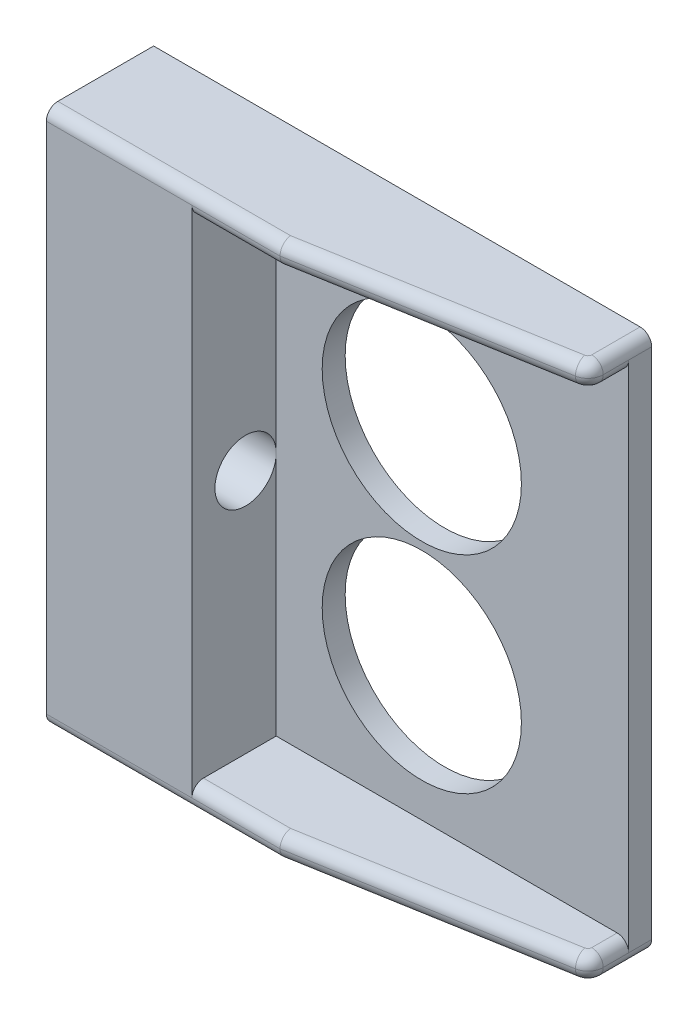
ISO-10303-21;
HEADER;
FILE_DESCRIPTION(('STEP AP214'),'2;1');
FILE_NAME('part.step','',(''),(''),'','','');
FILE_SCHEMA(('AUTOMOTIVE_DESIGN { 1 0 10303 214 1 1 1 1 }'));
ENDSEC;
DATA;
#1=APPLICATION_CONTEXT('core data for automotive mechanical design processes');
#2=APPLICATION_PROTOCOL_DEFINITION('international standard','automotive_design',2000,#1);
#3=PRODUCT_CONTEXT('',#1,'mechanical');
#4=PRODUCT('Part','Part','',(#3));
#5=PRODUCT_RELATED_PRODUCT_CATEGORY('part','',(#4));
#6=PRODUCT_DEFINITION_FORMATION('','',#4);
#7=PRODUCT_DEFINITION_CONTEXT('part definition',#1,'design');
#8=PRODUCT_DEFINITION('design','',#6,#7);
#9=PRODUCT_DEFINITION_SHAPE('','',#8);
#10=(LENGTH_UNIT() NAMED_UNIT(*) SI_UNIT(.MILLI.,.METRE.));
#11=(NAMED_UNIT(*) PLANE_ANGLE_UNIT() SI_UNIT($,.RADIAN.));
#12=(NAMED_UNIT(*) SI_UNIT($,.STERADIAN.) SOLID_ANGLE_UNIT());
#13=UNCERTAINTY_MEASURE_WITH_UNIT(LENGTH_MEASURE(1.E-05),#10,'distance_accuracy_value','');
#14=(GEOMETRIC_REPRESENTATION_CONTEXT(3) GLOBAL_UNCERTAINTY_ASSIGNED_CONTEXT((#13)) GLOBAL_UNIT_ASSIGNED_CONTEXT((#10,
#11,#12)) REPRESENTATION_CONTEXT('',''));
#15=CARTESIAN_POINT('',(0.,0.,0.));
#16=DIRECTION('',(0.,0.,1.));
#17=DIRECTION('',(1.,0.,0.));
#18=AXIS2_PLACEMENT_3D('',#15,#16,#17);
#19=CARTESIAN_POINT('',(0.,0.,3.));
#20=DIRECTION('',(0.,0.,-1.));
#21=DIRECTION('',(-1.,0.,0.));
#22=AXIS2_PLACEMENT_3D('',#19,#20,#21);
#23=PLANE('',#22);
#24=CARTESIAN_POINT('',(5.5,12.5,3.));
#25=DIRECTION('',(0.,0.,1.));
#26=DIRECTION('',(1.,0.,0.));
#27=AXIS2_PLACEMENT_3D('',#24,#25,#26);
#28=CIRCLE('',#27,13.);
#29=CARTESIAN_POINT('',(18.5,12.5,3.));
#30=VERTEX_POINT('',#29);
#31=EDGE_CURVE('E441',#30,#30,#28,.T.);
#32=ORIENTED_EDGE('',*,*,#31,.F.);
#33=EDGE_LOOP('',(#32));
#34=FACE_BOUND('',#33,.T.);
#35=CARTESIAN_POINT('',(5.5,-14.5,3.));
#36=DIRECTION('',(0.,0.,1.));
#37=DIRECTION('',(1.,0.,0.));
#38=AXIS2_PLACEMENT_3D('',#35,#36,#37);
#39=CIRCLE('',#38,13.);
#40=CARTESIAN_POINT('',(18.5,-14.5,3.));
#41=VERTEX_POINT('',#40);
#42=EDGE_CURVE('E437',#41,#41,#39,.T.);
#43=ORIENTED_EDGE('',*,*,#42,.F.);
#44=EDGE_LOOP('',(#43));
#45=FACE_BOUND('',#44,.T.);
#46=DIRECTION('',(0.,1.,0.));
#47=VECTOR('',#46,1.);
#48=CARTESIAN_POINT('',(32.5,-35.,3.));
#49=LINE('',#48,#47);
#50=CARTESIAN_POINT('',(32.5,-33.5,3.));
#51=VERTEX_POINT('',#50);
#52=CARTESIAN_POINT('',(32.5,33.5,3.));
#53=VERTEX_POINT('',#52);
#54=EDGE_CURVE('E389',#51,#53,#49,.T.);
#55=ORIENTED_EDGE('',*,*,#54,.T.);
#56=CARTESIAN_POINT('',(31.,33.5,3.));
#57=DIRECTION('',(0.,0.,-1.));
#58=DIRECTION('',(-1.,0.,0.));
#59=AXIS2_PLACEMENT_3D('',#56,#57,#58);
#60=CIRCLE('',#59,1.5);
#61=CARTESIAN_POINT('',(31.,32.,3.));
#62=VERTEX_POINT('',#61);
#63=EDGE_CURVE('E205',#53,#62,#60,.T.);
#64=ORIENTED_EDGE('',*,*,#63,.T.);
#65=DIRECTION('',(-1.,0.,0.));
#66=VECTOR('',#65,1.);
#67=CARTESIAN_POINT('',(32.5,32.,3.));
#68=LINE('',#67,#66);
#69=CARTESIAN_POINT('',(-13.5,32.,3.));
#70=VERTEX_POINT('',#69);
#71=EDGE_CURVE('E197',#62,#70,#68,.T.);
#72=ORIENTED_EDGE('',*,*,#71,.T.);
#73=DIRECTION('',(0.,1.,0.));
#74=VECTOR('',#73,1.);
#75=CARTESIAN_POINT('',(-13.5,-35.002,3.));
#76=LINE('',#75,#74);
#77=CARTESIAN_POINT('',(-13.5,0.,3.));
#78=VERTEX_POINT('',#77);
#79=EDGE_CURVE('E419',#78,#70,#76,.T.);
#80=ORIENTED_EDGE('',*,*,#79,.F.);
#81=CARTESIAN_POINT('',(-13.5,-32.,3.));
#82=VERTEX_POINT('',#81);
#83=EDGE_CURVE('E415',#82,#78,#76,.T.);
#84=ORIENTED_EDGE('',*,*,#83,.F.);
#85=DIRECTION('',(-1.,0.,0.));
#86=VECTOR('',#85,1.);
#87=CARTESIAN_POINT('',(32.5,-32.,3.));
#88=LINE('',#87,#86);
#89=CARTESIAN_POINT('',(31.,-32.,3.));
#90=VERTEX_POINT('',#89);
#91=EDGE_CURVE('E409',#90,#82,#88,.T.);
#92=ORIENTED_EDGE('',*,*,#91,.F.);
#93=CARTESIAN_POINT('',(31.,-33.5,3.));
#94=DIRECTION('',(0.,0.,-1.));
#95=DIRECTION('',(-1.,0.,0.));
#96=AXIS2_PLACEMENT_3D('',#93,#94,#95);
#97=CIRCLE('',#96,1.5);
#98=EDGE_CURVE('E210',#90,#51,#97,.T.);
#99=ORIENTED_EDGE('',*,*,#98,.T.);
#100=EDGE_LOOP('',(#55,#64,#72,#80,#84,#92,#99));
#101=FACE_BOUND('',#100,.T.);
#102=ADVANCED_FACE('F55',(#34,#45,#101),#23,.F.);
#103=CARTESIAN_POINT('',(0.,32.,0.));
#104=DIRECTION('',(0.,-1.,0.));
#105=DIRECTION('',(0.,0.,-1.));
#106=AXIS2_PLACEMENT_3D('',#103,#104,#105);
#107=PLANE('',#106);
#108=ORIENTED_EDGE('',*,*,#71,.F.);
#109=DIRECTION('',(0.,0.,-1.));
#110=VECTOR('',#109,1.);
#111=CARTESIAN_POINT('',(31.,32.,6.31780564696891));
#112=LINE('',#111,#110);
#113=CARTESIAN_POINT('',(31.,32.,6.31780564696891));
#114=VERTEX_POINT('',#113);
#115=EDGE_CURVE('E361',#62,#114,#112,.F.);
#116=ORIENTED_EDGE('',*,*,#115,.T.);
#117=CARTESIAN_POINT('',(30.5,32.,6.31780564696891));
#118=DIRECTION('',(0.,-1.,0.));
#119=DIRECTION('',(0.,0.,-1.));
#120=AXIS2_PLACEMENT_3D('',#117,#118,#119);
#121=CIRCLE('',#120,0.5);
#122=CARTESIAN_POINT('',(30.5856705873756,32.,6.81041152437875));
#123=VERTEX_POINT('',#122);
#124=EDGE_CURVE('E365',#114,#123,#121,.T.);
#125=ORIENTED_EDGE('',*,*,#124,.T.);
#126=DIRECTION('',(0.985211754819674,0.,-0.171341174751248));
#127=VECTOR('',#126,1.);
#128=CARTESIAN_POINT('',(2.04757539383643,32.,11.7735585145595));
#129=LINE('',#128,#127);
#130=CARTESIAN_POINT('',(-2.12946314744656,32.,12.5));
#131=VERTEX_POINT('',#130);
#132=EDGE_CURVE('E369',#123,#131,#129,.F.);
#133=ORIENTED_EDGE('',*,*,#132,.T.);
#134=DIRECTION('',(1.,0.,0.));
#135=VECTOR('',#134,1.);
#136=CARTESIAN_POINT('',(0.,32.,12.5));
#137=LINE('',#136,#135);
#138=CARTESIAN_POINT('',(-13.5,32.,12.5));
#139=VERTEX_POINT('',#138);
#140=EDGE_CURVE('E373',#131,#139,#137,.F.);
#141=ORIENTED_EDGE('',*,*,#140,.T.);
#142=DIRECTION('',(0.,0.,1.));
#143=VECTOR('',#142,1.);
#144=CARTESIAN_POINT('',(-13.5,32.,3.));
#145=LINE('',#144,#143);
#146=EDGE_CURVE('E257',#70,#139,#145,.T.);
#147=ORIENTED_EDGE('',*,*,#146,.F.);
#148=EDGE_LOOP('',(#108,#116,#125,#133,#141,#147));
#149=FACE_BOUND('',#148,.T.);
#150=ADVANCED_FACE('F462',(#149),#107,.T.);
#151=CARTESIAN_POINT('',(0.,-32.,0.));
#152=DIRECTION('',(0.,-1.,0.));
#153=DIRECTION('',(0.,0.,-1.));
#154=AXIS2_PLACEMENT_3D('',#151,#152,#153);
#155=PLANE('',#154);
#156=CARTESIAN_POINT('',(30.5,-32.,6.31780564696891));
#157=DIRECTION('',(0.,-1.,0.));
#158=DIRECTION('',(0.,0.,-1.));
#159=AXIS2_PLACEMENT_3D('',#156,#157,#158);
#160=CIRCLE('',#159,0.5);
#161=CARTESIAN_POINT('',(30.5856705873756,-32.,6.81041152437875));
#162=VERTEX_POINT('',#161);
#163=CARTESIAN_POINT('',(31.,-32.,6.31780564696891));
#164=VERTEX_POINT('',#163);
#165=EDGE_CURVE('E296',#162,#164,#160,.F.);
#166=ORIENTED_EDGE('',*,*,#165,.T.);
#167=DIRECTION('',(0.,0.,-1.));
#168=VECTOR('',#167,1.);
#169=CARTESIAN_POINT('',(31.,-32.,0.));
#170=LINE('',#169,#168);
#171=EDGE_CURVE('E287',#164,#90,#170,.T.);
#172=ORIENTED_EDGE('',*,*,#171,.T.);
#173=ORIENTED_EDGE('',*,*,#91,.T.);
#174=DIRECTION('',(0.,0.,1.));
#175=VECTOR('',#174,1.);
#176=CARTESIAN_POINT('',(-13.5,-32.,3.));
#177=LINE('',#176,#175);
#178=CARTESIAN_POINT('',(-13.5,-32.,12.5));
#179=VERTEX_POINT('',#178);
#180=EDGE_CURVE('E412',#82,#179,#177,.T.);
#181=ORIENTED_EDGE('',*,*,#180,.T.);
#182=DIRECTION('',(1.,0.,0.));
#183=VECTOR('',#182,1.);
#184=CARTESIAN_POINT('',(-2.,-32.,12.5));
#185=LINE('',#184,#183);
#186=CARTESIAN_POINT('',(-2.12946314744658,-32.,12.5));
#187=VERTEX_POINT('',#186);
#188=EDGE_CURVE('E337',#179,#187,#185,.T.);
#189=ORIENTED_EDGE('',*,*,#188,.T.);
#190=DIRECTION('',(0.985211754819674,0.,-0.171341174751248));
#191=VECTOR('',#190,1.);
#192=CARTESIAN_POINT('',(30.5856705873756,-32.,6.81041152437875));
#193=LINE('',#192,#191);
#194=EDGE_CURVE('E141',#187,#162,#193,.T.);
#195=ORIENTED_EDGE('',*,*,#194,.T.);
#196=EDGE_LOOP('',(#166,#172,#173,#181,#189,#195));
#197=FACE_BOUND('',#196,.T.);
#198=ADVANCED_FACE('F335',(#197),#155,.F.);
#199=CARTESIAN_POINT('',(-32.5,-35.,3.));
#200=DIRECTION('',(1.,0.,0.));
#201=DIRECTION('',(0.,0.,-1.));
#202=AXIS2_PLACEMENT_3D('',#199,#200,#201);
#203=PLANE('',#202);
#204=CARTESIAN_POINT('',(-32.5,0.,7.));
#205=DIRECTION('',(-1.,0.,0.));
#206=DIRECTION('',(0.,0.,1.));
#207=AXIS2_PLACEMENT_3D('',#204,#205,#206);
#208=CIRCLE('',#207,4.025);
#209=CARTESIAN_POINT('',(-32.5,0.,11.025));
#210=VERTEX_POINT('',#209);
#211=EDGE_CURVE('E429',#210,#210,#208,.T.);
#212=ORIENTED_EDGE('',*,*,#211,.F.);
#213=EDGE_LOOP('',(#212));
#214=FACE_BOUND('',#213,.T.);
#215=DIRECTION('',(0.,1.,0.));
#216=VECTOR('',#215,1.);
#217=CARTESIAN_POINT('',(-32.5,32.,14.));
#218=LINE('',#217,#216);
#219=CARTESIAN_POINT('',(-32.5,-33.5,14.));
#220=VERTEX_POINT('',#219);
#221=CARTESIAN_POINT('',(-32.5,33.5,14.));
#222=VERTEX_POINT('',#221);
#223=EDGE_CURVE('E179',#220,#222,#218,.T.);
#224=ORIENTED_EDGE('',*,*,#223,.T.);
#225=CARTESIAN_POINT('',(-32.5,33.5,12.5));
#226=DIRECTION('',(1.,0.,0.));
#227=DIRECTION('',(0.,0.,-1.));
#228=AXIS2_PLACEMENT_3D('',#225,#226,#227);
#229=CIRCLE('',#228,1.5);
#230=CARTESIAN_POINT('',(-32.5,35.,12.5));
#231=VERTEX_POINT('',#230);
#232=EDGE_CURVE('E192',#222,#231,#229,.F.);
#233=ORIENTED_EDGE('',*,*,#232,.T.);
#234=DIRECTION('',(0.,0.,-1.));
#235=VECTOR('',#234,1.);
#236=CARTESIAN_POINT('',(-32.5,35.,3.));
#237=LINE('',#236,#235);
#238=CARTESIAN_POINT('',(-32.5,35.,0.));
#239=VERTEX_POINT('',#238);
#240=EDGE_CURVE('E386',#231,#239,#237,.T.);
#241=ORIENTED_EDGE('',*,*,#240,.T.);
#242=DIRECTION('',(0.,-1.,0.));
#243=VECTOR('',#242,1.);
#244=CARTESIAN_POINT('',(-32.5,-35.,0.));
#245=LINE('',#244,#243);
#246=CARTESIAN_POINT('',(-32.5,-35.,0.));
#247=VERTEX_POINT('',#246);
#248=EDGE_CURVE('E196',#239,#247,#245,.T.);
#249=ORIENTED_EDGE('',*,*,#248,.T.);
#250=DIRECTION('',(0.,0.,-1.));
#251=VECTOR('',#250,1.);
#252=CARTESIAN_POINT('',(-32.5,-35.,3.));
#253=LINE('',#252,#251);
#254=CARTESIAN_POINT('',(-32.5,-35.,12.5));
#255=VERTEX_POINT('',#254);
#256=EDGE_CURVE('E383',#255,#247,#253,.T.);
#257=ORIENTED_EDGE('',*,*,#256,.F.);
#258=CARTESIAN_POINT('',(-32.5,-33.5,12.5));
#259=DIRECTION('',(1.,0.,0.));
#260=DIRECTION('',(0.,0.,-1.));
#261=AXIS2_PLACEMENT_3D('',#258,#259,#260);
#262=CIRCLE('',#261,1.5);
#263=EDGE_CURVE('E184',#255,#220,#262,.F.);
#264=ORIENTED_EDGE('',*,*,#263,.T.);
#265=EDGE_LOOP('',(#224,#233,#241,#249,#257,#264));
#266=FACE_BOUND('',#265,.T.);
#267=ADVANCED_FACE('F189',(#214,#266),#203,.F.);
#268=CARTESIAN_POINT('',(-32.5,-35.,3.));
#269=DIRECTION('',(0.,1.,0.));
#270=DIRECTION('',(0.,0.,1.));
#271=AXIS2_PLACEMENT_3D('',#268,#269,#270);
#272=PLANE('',#271);
#273=DIRECTION('',(1.,0.,0.));
#274=VECTOR('',#273,1.);
#275=CARTESIAN_POINT('',(-32.5,-35.,0.));
#276=LINE('',#275,#274);
#277=CARTESIAN_POINT('',(31.,-35.,0.));
#278=VERTEX_POINT('',#277);
#279=EDGE_CURVE('E317',#247,#278,#276,.T.);
#280=ORIENTED_EDGE('',*,*,#279,.T.);
#281=DIRECTION('',(0.,0.,-1.));
#282=VECTOR('',#281,1.);
#283=CARTESIAN_POINT('',(31.,-35.,3.));
#284=LINE('',#283,#282);
#285=CARTESIAN_POINT('',(31.,-35.,6.31780564696891));
#286=VERTEX_POINT('',#285);
#287=EDGE_CURVE('E308',#278,#286,#284,.F.);
#288=ORIENTED_EDGE('',*,*,#287,.T.);
#289=CARTESIAN_POINT('',(30.5,-35.,6.31780564696891));
#290=DIRECTION('',(0.,1.,0.));
#291=DIRECTION('',(0.,0.,1.));
#292=AXIS2_PLACEMENT_3D('',#289,#290,#291);
#293=CIRCLE('',#292,0.5);
#294=CARTESIAN_POINT('',(30.5856705873756,-35.,6.81041152437875));
#295=VERTEX_POINT('',#294);
#296=EDGE_CURVE('E158',#286,#295,#293,.F.);
#297=ORIENTED_EDGE('',*,*,#296,.T.);
#298=DIRECTION('',(0.985211754819674,0.,-0.171341174751248));
#299=VECTOR('',#298,1.);
#300=CARTESIAN_POINT('',(-2.25701176212687,-35.,12.5221823677705));
#301=LINE('',#300,#299);
#302=CARTESIAN_POINT('',(-2.12946314744656,-35.,12.5));
#303=VERTEX_POINT('',#302);
#304=EDGE_CURVE('E295',#295,#303,#301,.F.);
#305=ORIENTED_EDGE('',*,*,#304,.T.);
#306=DIRECTION('',(1.,0.,0.));
#307=VECTOR('',#306,1.);
#308=CARTESIAN_POINT('',(-32.5,-35.,12.5));
#309=LINE('',#308,#307);
#310=EDGE_CURVE('E113',#303,#255,#309,.F.);
#311=ORIENTED_EDGE('',*,*,#310,.T.);
#312=ORIENTED_EDGE('',*,*,#256,.T.);
#313=EDGE_LOOP('',(#280,#288,#297,#305,#311,#312));
#314=FACE_BOUND('',#313,.T.);
#315=ADVANCED_FACE('F313',(#314),#272,.F.);
#316=CARTESIAN_POINT('',(32.5,-35.,3.));
#317=DIRECTION('',(-1.,0.,0.));
#318=DIRECTION('',(0.,0.,1.));
#319=AXIS2_PLACEMENT_3D('',#316,#317,#318);
#320=PLANE('',#319);
#321=DIRECTION('',(0.,0.,-1.));
#322=VECTOR('',#321,1.);
#323=CARTESIAN_POINT('',(32.5,33.5,3.));
#324=LINE('',#323,#322);
#325=CARTESIAN_POINT('',(32.5,33.5,0.));
#326=VERTEX_POINT('',#325);
#327=EDGE_CURVE('E377',#326,#53,#324,.F.);
#328=ORIENTED_EDGE('',*,*,#327,.T.);
#329=ORIENTED_EDGE('',*,*,#54,.F.);
#330=DIRECTION('',(0.,0.,-1.));
#331=VECTOR('',#330,1.);
#332=CARTESIAN_POINT('',(32.5,-33.5,3.));
#333=LINE('',#332,#331);
#334=CARTESIAN_POINT('',(32.5,-33.5,0.));
#335=VERTEX_POINT('',#334);
#336=EDGE_CURVE('E282',#51,#335,#333,.T.);
#337=ORIENTED_EDGE('',*,*,#336,.T.);
#338=DIRECTION('',(0.,1.,0.));
#339=VECTOR('',#338,1.);
#340=CARTESIAN_POINT('',(32.5,-35.,0.));
#341=LINE('',#340,#339);
#342=EDGE_CURVE('E394',#335,#326,#341,.T.);
#343=ORIENTED_EDGE('',*,*,#342,.T.);
#344=EDGE_LOOP('',(#328,#329,#337,#343));
#345=FACE_BOUND('',#344,.T.);
#346=ADVANCED_FACE('F476',(#345),#320,.F.);
#347=CARTESIAN_POINT('',(-32.5,35.,3.));
#348=DIRECTION('',(0.,-1.,0.));
#349=DIRECTION('',(0.,0.,-1.));
#350=AXIS2_PLACEMENT_3D('',#347,#348,#349);
#351=PLANE('',#350);
#352=CARTESIAN_POINT('',(30.5,35.,6.31780564696891));
#353=DIRECTION('',(0.,-1.,0.));
#354=DIRECTION('',(0.,0.,-1.));
#355=AXIS2_PLACEMENT_3D('',#352,#353,#354);
#356=CIRCLE('',#355,0.5);
#357=CARTESIAN_POINT('',(30.5856705873756,35.,6.81041152437875));
#358=VERTEX_POINT('',#357);
#359=CARTESIAN_POINT('',(31.,35.,6.31780564696891));
#360=VERTEX_POINT('',#359);
#361=EDGE_CURVE('E352',#358,#360,#356,.F.);
#362=ORIENTED_EDGE('',*,*,#361,.T.);
#363=DIRECTION('',(0.,0.,-1.));
#364=VECTOR('',#363,1.);
#365=CARTESIAN_POINT('',(31.,35.,3.));
#366=LINE('',#365,#364);
#367=CARTESIAN_POINT('',(31.,35.,0.));
#368=VERTEX_POINT('',#367);
#369=EDGE_CURVE('E348',#360,#368,#366,.T.);
#370=ORIENTED_EDGE('',*,*,#369,.T.);
#371=DIRECTION('',(-1.,0.,0.));
#372=VECTOR('',#371,1.);
#373=CARTESIAN_POINT('',(-32.5,35.,0.));
#374=LINE('',#373,#372);
#375=EDGE_CURVE('E390',#368,#239,#374,.T.);
#376=ORIENTED_EDGE('',*,*,#375,.T.);
#377=ORIENTED_EDGE('',*,*,#240,.F.);
#378=DIRECTION('',(1.,0.,0.));
#379=VECTOR('',#378,1.);
#380=CARTESIAN_POINT('',(-2.,35.,12.5));
#381=LINE('',#380,#379);
#382=CARTESIAN_POINT('',(-2.12946314744656,35.,12.5));
#383=VERTEX_POINT('',#382);
#384=EDGE_CURVE('E203',#231,#383,#381,.T.);
#385=ORIENTED_EDGE('',*,*,#384,.T.);
#386=DIRECTION('',(0.985211754819674,0.,-0.171341174751248));
#387=VECTOR('',#386,1.);
#388=CARTESIAN_POINT('',(30.5856705873756,35.,6.81041152437875));
#389=LINE('',#388,#387);
#390=EDGE_CURVE('E355',#383,#358,#389,.T.);
#391=ORIENTED_EDGE('',*,*,#390,.T.);
#392=EDGE_LOOP('',(#362,#370,#376,#377,#385,#391));
#393=FACE_BOUND('',#392,.T.);
#394=ADVANCED_FACE('F506',(#393),#351,.F.);
#395=CARTESIAN_POINT('',(0.,0.,0.));
#396=DIRECTION('',(0.,0.,-1.));
#397=DIRECTION('',(-1.,0.,0.));
#398=AXIS2_PLACEMENT_3D('',#395,#396,#397);
#399=PLANE('',#398);
#400=CARTESIAN_POINT('',(5.5,12.5,0.));
#401=DIRECTION('',(0.,0.,1.));
#402=DIRECTION('',(1.,0.,0.));
#403=AXIS2_PLACEMENT_3D('',#400,#401,#402);
#404=CIRCLE('',#403,13.);
#405=CARTESIAN_POINT('',(18.5,12.5,0.));
#406=VERTEX_POINT('',#405);
#407=EDGE_CURVE('E445',#406,#406,#404,.T.);
#408=ORIENTED_EDGE('',*,*,#407,.T.);
#409=EDGE_LOOP('',(#408));
#410=FACE_BOUND('',#409,.T.);
#411=CARTESIAN_POINT('',(5.5,-14.5,0.));
#412=DIRECTION('',(0.,0.,1.));
#413=DIRECTION('',(1.,0.,0.));
#414=AXIS2_PLACEMENT_3D('',#411,#412,#413);
#415=CIRCLE('',#414,13.);
#416=CARTESIAN_POINT('',(18.5,-14.5,0.));
#417=VERTEX_POINT('',#416);
#418=EDGE_CURVE('E433',#417,#417,#415,.T.);
#419=ORIENTED_EDGE('',*,*,#418,.T.);
#420=EDGE_LOOP('',(#419));
#421=FACE_BOUND('',#420,.T.);
#422=ORIENTED_EDGE('',*,*,#375,.F.);
#423=CARTESIAN_POINT('',(31.,33.5,0.));
#424=DIRECTION('',(0.,0.,-1.));
#425=DIRECTION('',(-1.,0.,0.));
#426=AXIS2_PLACEMENT_3D('',#423,#424,#425);
#427=CIRCLE('',#426,1.5);
#428=EDGE_CURVE('E340',#368,#326,#427,.T.);
#429=ORIENTED_EDGE('',*,*,#428,.T.);
#430=ORIENTED_EDGE('',*,*,#342,.F.);
#431=CARTESIAN_POINT('',(31.,-33.5,0.));
#432=DIRECTION('',(0.,0.,-1.));
#433=DIRECTION('',(-1.,0.,0.));
#434=AXIS2_PLACEMENT_3D('',#431,#432,#433);
#435=CIRCLE('',#434,1.5);
#436=EDGE_CURVE('E320',#335,#278,#435,.T.);
#437=ORIENTED_EDGE('',*,*,#436,.T.);
#438=ORIENTED_EDGE('',*,*,#279,.F.);
#439=ORIENTED_EDGE('',*,*,#248,.F.);
#440=EDGE_LOOP('',(#422,#429,#430,#437,#438,#439));
#441=FACE_BOUND('',#440,.T.);
#442=ADVANCED_FACE('F450',(#410,#421,#441),#399,.T.);
#443=CARTESIAN_POINT('',(-2.,32.,14.));
#444=DIRECTION('',(0.,0.,1.));
#445=DIRECTION('',(1.,0.,0.));
#446=AXIS2_PLACEMENT_3D('',#443,#444,#445);
#447=PLANE('',#446);
#448=DIRECTION('',(0.,1.,0.));
#449=VECTOR('',#448,1.);
#450=CARTESIAN_POINT('',(-13.5,-35.002,14.));
#451=LINE('',#450,#449);
#452=CARTESIAN_POINT('',(-13.5,-33.5,14.));
#453=VERTEX_POINT('',#452);
#454=CARTESIAN_POINT('',(-13.5,33.5,14.));
#455=VERTEX_POINT('',#454);
#456=EDGE_CURVE('E78',#453,#455,#451,.T.);
#457=ORIENTED_EDGE('',*,*,#456,.T.);
#458=DIRECTION('',(1.,0.,0.));
#459=VECTOR('',#458,1.);
#460=CARTESIAN_POINT('',(-32.5,33.5,14.));
#461=LINE('',#460,#459);
#462=EDGE_CURVE('E176',#455,#222,#461,.F.);
#463=ORIENTED_EDGE('',*,*,#462,.T.);
#464=ORIENTED_EDGE('',*,*,#223,.F.);
#465=DIRECTION('',(1.,0.,0.));
#466=VECTOR('',#465,1.);
#467=CARTESIAN_POINT('',(-2.,-33.5,14.));
#468=LINE('',#467,#466);
#469=EDGE_CURVE('E185',#220,#453,#468,.T.);
#470=ORIENTED_EDGE('',*,*,#469,.T.);
#471=EDGE_LOOP('',(#457,#463,#464,#470));
#472=FACE_BOUND('',#471,.T.);
#473=ADVANCED_FACE('F178',(#472),#447,.T.);
#474=CARTESIAN_POINT('',(-13.5,-35.002,3.));
#475=DIRECTION('',(-1.,0.,0.));
#476=DIRECTION('',(0.,0.,1.));
#477=AXIS2_PLACEMENT_3D('',#474,#475,#476);
#478=PLANE('',#477);
#479=ORIENTED_EDGE('',*,*,#83,.T.);
#480=CARTESIAN_POINT('',(-13.5,0.,7.));
#481=DIRECTION('',(-1.,0.,0.));
#482=DIRECTION('',(0.,0.,1.));
#483=AXIS2_PLACEMENT_3D('',#480,#481,#482);
#484=CIRCLE('',#483,4.);
#485=EDGE_CURVE('E59',#78,#78,#484,.T.);
#486=ORIENTED_EDGE('',*,*,#485,.T.);
#487=ORIENTED_EDGE('',*,*,#79,.T.);
#488=ORIENTED_EDGE('',*,*,#146,.T.);
#489=CARTESIAN_POINT('',(-13.5,33.5,12.5));
#490=DIRECTION('',(-1.,0.,0.));
#491=DIRECTION('',(0.,0.,1.));
#492=AXIS2_PLACEMENT_3D('',#489,#490,#491);
#493=CIRCLE('',#492,1.5);
#494=EDGE_CURVE('E65',#139,#455,#493,.T.);
#495=ORIENTED_EDGE('',*,*,#494,.T.);
#496=ORIENTED_EDGE('',*,*,#456,.F.);
#497=CARTESIAN_POINT('',(-13.5,-33.5,12.5));
#498=DIRECTION('',(-1.,0.,0.));
#499=DIRECTION('',(0.,0.,1.));
#500=AXIS2_PLACEMENT_3D('',#497,#498,#499);
#501=CIRCLE('',#500,1.5);
#502=EDGE_CURVE('E11',#453,#179,#501,.T.);
#503=ORIENTED_EDGE('',*,*,#502,.T.);
#504=ORIENTED_EDGE('',*,*,#180,.F.);
#505=EDGE_LOOP('',(#479,#486,#487,#488,#495,#496,#503,#504));
#506=FACE_BOUND('',#505,.T.);
#507=ADVANCED_FACE('F554',(#506),#478,.F.);
#508=CARTESIAN_POINT('',(-32.5,33.5,12.5));
#509=DIRECTION('',(-1.,0.,0.));
#510=DIRECTION('',(0.,0.,1.));
#511=AXIS2_PLACEMENT_3D('',#508,#509,#510);
#512=CYLINDRICAL_SURFACE('',#511,1.5);
#513=ORIENTED_EDGE('',*,*,#232,.F.);
#514=ORIENTED_EDGE('',*,*,#462,.F.);
#515=DIRECTION('',(1.,0.,0.));
#516=VECTOR('',#515,1.);
#517=CARTESIAN_POINT('',(-32.5,33.5,14.));
#518=LINE('',#517,#516);
#519=CARTESIAN_POINT('',(-2.,33.5,14.));
#520=VERTEX_POINT('',#519);
#521=EDGE_CURVE('E254',#520,#455,#518,.F.);
#522=ORIENTED_EDGE('',*,*,#521,.F.);
#523=CARTESIAN_POINT('',(-2.12946314744656,33.5,12.5));
#524=DIRECTION('',(-0.996296079190236,0.,0.0859890841337594));
#525=DIRECTION('',(-0.0859890841337594,0.,-0.996296079190236));
#526=AXIS2_PLACEMENT_3D('',#523,#524,#525);
#527=ELLIPSE('',#526,1.50557653626336,1.5);
#528=EDGE_CURVE('E250',#383,#520,#527,.F.);
#529=ORIENTED_EDGE('',*,*,#528,.F.);
#530=ORIENTED_EDGE('',*,*,#384,.F.);
#531=EDGE_LOOP('',(#513,#514,#522,#529,#530));
#532=FACE_BOUND('',#531,.T.);
#533=ADVANCED_FACE('F200',(#532),#512,.T.);
#534=CARTESIAN_POINT('',(-2.,33.5,12.5));
#535=DIRECTION('',(1.,0.,0.));
#536=DIRECTION('',(0.,0.,-1.));
#537=AXIS2_PLACEMENT_3D('',#534,#535,#536);
#538=CYLINDRICAL_SURFACE('',#537,1.5);
#539=ORIENTED_EDGE('',*,*,#494,.F.);
#540=ORIENTED_EDGE('',*,*,#140,.F.);
#541=CARTESIAN_POINT('',(-2.12946314744657,33.5,12.5));
#542=DIRECTION('',(0.996296079190236,0.,-0.0859890841337594));
#543=DIRECTION('',(0.0859890841337594,0.,0.996296079190236));
#544=AXIS2_PLACEMENT_3D('',#541,#542,#543);
#545=ELLIPSE('',#544,1.50557653626336,1.5);
#546=EDGE_CURVE('E246',#520,#131,#545,.T.);
#547=ORIENTED_EDGE('',*,*,#546,.F.);
#548=ORIENTED_EDGE('',*,*,#521,.T.);
#549=EDGE_LOOP('',(#539,#540,#547,#548));
#550=FACE_BOUND('',#549,.T.);
#551=ADVANCED_FACE('F532',(#550),#538,.T.);
#552=CARTESIAN_POINT('',(-30.0047181841452,33.5,17.347870441165));
#553=DIRECTION('',(-0.985211754819674,0.,0.171341174751248));
#554=DIRECTION('',(0.171341174751248,0.,0.985211754819674));
#555=AXIS2_PLACEMENT_3D('',#552,#553,#554);
#556=CYLINDRICAL_SURFACE('',#555,1.5);
#557=ORIENTED_EDGE('',*,*,#390,.F.);
#558=ORIENTED_EDGE('',*,*,#528,.T.);
#559=DIRECTION('',(0.985211754819674,0.,-0.171341174751248));
#560=VECTOR('',#559,1.);
#561=CARTESIAN_POINT('',(-2.,33.5,14.));
#562=LINE('',#561,#560);
#563=CARTESIAN_POINT('',(30.8426823495025,33.5,8.28822915660826));
#564=VERTEX_POINT('',#563);
#565=EDGE_CURVE('E242',#564,#520,#562,.F.);
#566=ORIENTED_EDGE('',*,*,#565,.F.);
#567=CARTESIAN_POINT('',(30.5856705873756,33.5,6.81041152437875));
#568=DIRECTION('',(0.985211754819674,0.,-0.171341174751249));
#569=DIRECTION('',(-0.171341174751249,0.,-0.985211754819674));
#570=AXIS2_PLACEMENT_3D('',#567,#568,#569);
#571=CIRCLE('',#570,1.5);
#572=EDGE_CURVE('E238',#358,#564,#571,.T.);
#573=ORIENTED_EDGE('',*,*,#572,.F.);
#574=EDGE_LOOP('',(#557,#558,#566,#573));
#575=FACE_BOUND('',#574,.T.);
#576=ADVANCED_FACE('F509',(#575),#556,.T.);
#577=CARTESIAN_POINT('',(32.2429882378731,33.5,6.52218236777049));
#578=DIRECTION('',(0.985211754819674,0.,-0.171341174751248));
#579=DIRECTION('',(-0.171341174751248,0.,-0.985211754819674));
#580=AXIS2_PLACEMENT_3D('',#577,#578,#579);
#581=CYLINDRICAL_SURFACE('',#580,1.5);
#582=ORIENTED_EDGE('',*,*,#546,.T.);
#583=ORIENTED_EDGE('',*,*,#132,.F.);
#584=CARTESIAN_POINT('',(30.5856705873756,33.5,6.81041152437875));
#585=DIRECTION('',(0.985211754819675,0.,-0.171341174751247));
#586=DIRECTION('',(-0.171341174751247,0.,-0.985211754819675));
#587=AXIS2_PLACEMENT_3D('',#584,#585,#586);
#588=CIRCLE('',#587,1.5);
#589=EDGE_CURVE('E234',#564,#123,#588,.T.);
#590=ORIENTED_EDGE('',*,*,#589,.F.);
#591=ORIENTED_EDGE('',*,*,#565,.T.);
#592=EDGE_LOOP('',(#582,#583,#590,#591));
#593=FACE_BOUND('',#592,.T.);
#594=ADVANCED_FACE('F533',(#593),#581,.T.);
#595=CARTESIAN_POINT('',(30.5,33.5,6.31780564696891));
#596=DIRECTION('',(0.,-1.,0.));
#597=DIRECTION('',(0.,0.,-1.));
#598=AXIS2_PLACEMENT_3D('',#595,#596,#597);
#599=DEGENERATE_TOROIDAL_SURFACE('',#598,0.5,1.5,.T.);
#600=ORIENTED_EDGE('',*,*,#361,.F.);
#601=ORIENTED_EDGE('',*,*,#572,.T.);
#602=CARTESIAN_POINT('',(30.5,33.5,6.31780564696891));
#603=DIRECTION('',(0.,-1.,0.));
#604=DIRECTION('',(0.,0.,-1.));
#605=AXIS2_PLACEMENT_3D('',#602,#603,#604);
#606=CIRCLE('',#605,2.);
#607=CARTESIAN_POINT('',(32.5,33.5,6.31780564696891));
#608=VERTEX_POINT('',#607);
#609=EDGE_CURVE('E230',#608,#564,#606,.T.);
#610=ORIENTED_EDGE('',*,*,#609,.F.);
#611=CARTESIAN_POINT('',(31.,33.5,6.31780564696891));
#612=DIRECTION('',(0.,0.,-1.));
#613=DIRECTION('',(-1.,0.,0.));
#614=AXIS2_PLACEMENT_3D('',#611,#612,#613);
#615=CIRCLE('',#614,1.5);
#616=EDGE_CURVE('E226',#360,#608,#615,.T.);
#617=ORIENTED_EDGE('',*,*,#616,.F.);
#618=EDGE_LOOP('',(#600,#601,#610,#617));
#619=FACE_BOUND('',#618,.T.);
#620=ADVANCED_FACE('F512',(#619),#599,.T.);
#621=CARTESIAN_POINT('',(30.5,33.5,6.31780564696891));
#622=DIRECTION('',(0.,-1.,0.));
#623=DIRECTION('',(0.,0.,-1.));
#624=AXIS2_PLACEMENT_3D('',#621,#622,#623);
#625=DEGENERATE_TOROIDAL_SURFACE('',#624,0.5,1.5,.T.);
#626=ORIENTED_EDGE('',*,*,#589,.T.);
#627=ORIENTED_EDGE('',*,*,#124,.F.);
#628=CARTESIAN_POINT('',(31.,33.5,6.31780564696891));
#629=DIRECTION('',(0.,0.,-1.));
#630=DIRECTION('',(-1.,0.,0.));
#631=AXIS2_PLACEMENT_3D('',#628,#629,#630);
#632=CIRCLE('',#631,1.5);
#633=EDGE_CURVE('E222',#608,#114,#632,.T.);
#634=ORIENTED_EDGE('',*,*,#633,.F.);
#635=ORIENTED_EDGE('',*,*,#609,.T.);
#636=EDGE_LOOP('',(#626,#627,#634,#635));
#637=FACE_BOUND('',#636,.T.);
#638=ADVANCED_FACE('F535',(#637),#625,.T.);
#639=CARTESIAN_POINT('',(31.,33.5,3.));
#640=DIRECTION('',(0.,0.,-1.));
#641=DIRECTION('',(-1.,0.,0.));
#642=AXIS2_PLACEMENT_3D('',#639,#640,#641);
#643=CYLINDRICAL_SURFACE('',#642,1.5);
#644=ORIENTED_EDGE('',*,*,#369,.F.);
#645=ORIENTED_EDGE('',*,*,#616,.T.);
#646=DIRECTION('',(0.,0.,-1.));
#647=VECTOR('',#646,1.);
#648=CARTESIAN_POINT('',(32.5,33.5,3.));
#649=LINE('',#648,#647);
#650=EDGE_CURVE('E118',#53,#608,#649,.F.);
#651=ORIENTED_EDGE('',*,*,#650,.F.);
#652=ORIENTED_EDGE('',*,*,#327,.F.);
#653=ORIENTED_EDGE('',*,*,#428,.F.);
#654=EDGE_LOOP('',(#644,#645,#651,#652,#653));
#655=FACE_BOUND('',#654,.T.);
#656=ADVANCED_FACE('F481',(#655),#643,.T.);
#657=CARTESIAN_POINT('',(31.,33.5,3.));
#658=DIRECTION('',(0.,0.,1.));
#659=DIRECTION('',(1.,0.,0.));
#660=AXIS2_PLACEMENT_3D('',#657,#658,#659);
#661=CYLINDRICAL_SURFACE('',#660,1.5);
#662=ORIENTED_EDGE('',*,*,#633,.T.);
#663=ORIENTED_EDGE('',*,*,#115,.F.);
#664=ORIENTED_EDGE('',*,*,#63,.F.);
#665=ORIENTED_EDGE('',*,*,#650,.T.);
#666=EDGE_LOOP('',(#662,#663,#664,#665));
#667=FACE_BOUND('',#666,.T.);
#668=ADVANCED_FACE('F486',(#667),#661,.T.);
#669=CARTESIAN_POINT('',(-2.,-33.5,12.5));
#670=DIRECTION('',(-1.,0.,0.));
#671=DIRECTION('',(0.,0.,1.));
#672=AXIS2_PLACEMENT_3D('',#669,#670,#671);
#673=CYLINDRICAL_SURFACE('',#672,1.5);
#674=ORIENTED_EDGE('',*,*,#263,.F.);
#675=ORIENTED_EDGE('',*,*,#310,.F.);
#676=CARTESIAN_POINT('',(-2.1294631474466,-33.5,12.5));
#677=DIRECTION('',(-0.996296079190236,0.,0.0859890841337594));
#678=DIRECTION('',(0.0859890841337594,0.,0.996296079190236));
#679=AXIS2_PLACEMENT_3D('',#676,#677,#678);
#680=ELLIPSE('',#679,1.50557653626336,1.5);
#681=CARTESIAN_POINT('',(-2.,-33.5,14.));
#682=VERTEX_POINT('',#681);
#683=EDGE_CURVE('E105',#682,#303,#680,.F.);
#684=ORIENTED_EDGE('',*,*,#683,.F.);
#685=DIRECTION('',(1.,0.,0.));
#686=VECTOR('',#685,1.);
#687=CARTESIAN_POINT('',(-2.,-33.5,14.));
#688=LINE('',#687,#686);
#689=EDGE_CURVE('E109',#453,#682,#688,.T.);
#690=ORIENTED_EDGE('',*,*,#689,.F.);
#691=ORIENTED_EDGE('',*,*,#469,.F.);
#692=EDGE_LOOP('',(#674,#675,#684,#690,#691));
#693=FACE_BOUND('',#692,.T.);
#694=ADVANCED_FACE('F57',(#693),#673,.T.);
#695=CARTESIAN_POINT('',(32.2429882378731,-33.5,6.52218236777049));
#696=DIRECTION('',(-0.985211754819674,0.,0.171341174751248));
#697=DIRECTION('',(0.171341174751248,0.,0.985211754819674));
#698=AXIS2_PLACEMENT_3D('',#695,#696,#697);
#699=CYLINDRICAL_SURFACE('',#698,1.5);
#700=ORIENTED_EDGE('',*,*,#683,.T.);
#701=ORIENTED_EDGE('',*,*,#304,.F.);
#702=CARTESIAN_POINT('',(30.5856705873756,-33.5,6.81041152437875));
#703=DIRECTION('',(0.985211754819675,0.,-0.171341174751247));
#704=DIRECTION('',(-0.171341174751247,0.,-0.985211754819675));
#705=AXIS2_PLACEMENT_3D('',#702,#703,#704);
#706=CIRCLE('',#705,1.5);
#707=CARTESIAN_POINT('',(30.8426823495025,-33.5,8.28822915660826));
#708=VERTEX_POINT('',#707);
#709=EDGE_CURVE('E128',#708,#295,#706,.T.);
#710=ORIENTED_EDGE('',*,*,#709,.F.);
#711=DIRECTION('',(0.985211754819674,0.,-0.171341174751248));
#712=VECTOR('',#711,1.);
#713=CARTESIAN_POINT('',(30.8426823495025,-33.5,8.28822915660826));
#714=LINE('',#713,#712);
#715=EDGE_CURVE('E131',#682,#708,#714,.T.);
#716=ORIENTED_EDGE('',*,*,#715,.F.);
#717=EDGE_LOOP('',(#700,#701,#710,#716));
#718=FACE_BOUND('',#717,.T.);
#719=ADVANCED_FACE('F132',(#718),#699,.T.);
#720=CARTESIAN_POINT('',(0.,-33.5,12.5));
#721=DIRECTION('',(-1.,0.,0.));
#722=DIRECTION('',(0.,0.,1.));
#723=AXIS2_PLACEMENT_3D('',#720,#721,#722);
#724=CYLINDRICAL_SURFACE('',#723,1.5);
#725=ORIENTED_EDGE('',*,*,#502,.F.);
#726=ORIENTED_EDGE('',*,*,#689,.T.);
#727=CARTESIAN_POINT('',(-2.12946314744657,-33.5,12.5));
#728=DIRECTION('',(-0.996296079190236,0.,0.0859890841337594));
#729=DIRECTION('',(-0.0859890841337594,0.,-0.996296079190236));
#730=AXIS2_PLACEMENT_3D('',#727,#728,#729);
#731=ELLIPSE('',#730,1.50557653626336,1.5);
#732=EDGE_CURVE('E125',#187,#682,#731,.F.);
#733=ORIENTED_EDGE('',*,*,#732,.F.);
#734=ORIENTED_EDGE('',*,*,#188,.F.);
#735=EDGE_LOOP('',(#725,#726,#733,#734));
#736=FACE_BOUND('',#735,.T.);
#737=ADVANCED_FACE('F121',(#736),#724,.T.);
#738=CARTESIAN_POINT('',(30.5,-33.5,6.31780564696891));
#739=DIRECTION('',(0.,1.,0.));
#740=DIRECTION('',(0.,0.,1.));
#741=AXIS2_PLACEMENT_3D('',#738,#739,#740);
#742=DEGENERATE_TOROIDAL_SURFACE('',#741,0.5,1.5,.T.);
#743=ORIENTED_EDGE('',*,*,#709,.T.);
#744=ORIENTED_EDGE('',*,*,#296,.F.);
#745=CARTESIAN_POINT('',(31.,-33.5,6.31780564696891));
#746=DIRECTION('',(0.,0.,-1.));
#747=DIRECTION('',(-1.,0.,0.));
#748=AXIS2_PLACEMENT_3D('',#745,#746,#747);
#749=CIRCLE('',#748,1.5);
#750=CARTESIAN_POINT('',(32.5,-33.5,6.31780564696891));
#751=VERTEX_POINT('',#750);
#752=EDGE_CURVE('E143',#751,#286,#749,.T.);
#753=ORIENTED_EDGE('',*,*,#752,.F.);
#754=CARTESIAN_POINT('',(30.5,-33.5,6.31780564696891));
#755=DIRECTION('',(0.,1.,0.));
#756=DIRECTION('',(0.,0.,1.));
#757=AXIS2_PLACEMENT_3D('',#754,#755,#756);
#758=CIRCLE('',#757,2.);
#759=EDGE_CURVE('E147',#708,#751,#758,.T.);
#760=ORIENTED_EDGE('',*,*,#759,.F.);
#761=EDGE_LOOP('',(#743,#744,#753,#760));
#762=FACE_BOUND('',#761,.T.);
#763=ADVANCED_FACE('F155',(#762),#742,.T.);
#764=CARTESIAN_POINT('',(2.04757539383643,-33.5,11.7735585145595));
#765=DIRECTION('',(-0.985211754819674,0.,0.171341174751248));
#766=DIRECTION('',(0.171341174751248,0.,0.985211754819674));
#767=AXIS2_PLACEMENT_3D('',#764,#765,#766);
#768=CYLINDRICAL_SURFACE('',#767,1.5);
#769=ORIENTED_EDGE('',*,*,#732,.T.);
#770=ORIENTED_EDGE('',*,*,#715,.T.);
#771=CARTESIAN_POINT('',(30.5856705873756,-33.5,6.81041152437875));
#772=DIRECTION('',(0.985211754819674,0.,-0.171341174751249));
#773=DIRECTION('',(-0.171341174751249,0.,-0.985211754819674));
#774=AXIS2_PLACEMENT_3D('',#771,#772,#773);
#775=CIRCLE('',#774,1.5);
#776=EDGE_CURVE('E266',#162,#708,#775,.T.);
#777=ORIENTED_EDGE('',*,*,#776,.F.);
#778=ORIENTED_EDGE('',*,*,#194,.F.);
#779=EDGE_LOOP('',(#769,#770,#777,#778));
#780=FACE_BOUND('',#779,.T.);
#781=ADVANCED_FACE('F139',(#780),#768,.T.);
#782=CARTESIAN_POINT('',(31.,-33.5,3.));
#783=DIRECTION('',(0.,0.,-1.));
#784=DIRECTION('',(-1.,0.,0.));
#785=AXIS2_PLACEMENT_3D('',#782,#783,#784);
#786=CYLINDRICAL_SURFACE('',#785,1.5);
#787=ORIENTED_EDGE('',*,*,#436,.F.);
#788=ORIENTED_EDGE('',*,*,#336,.F.);
#789=DIRECTION('',(0.,0.,-1.));
#790=VECTOR('',#789,1.);
#791=CARTESIAN_POINT('',(32.5,-33.5,3.));
#792=LINE('',#791,#790);
#793=EDGE_CURVE('E262',#751,#51,#792,.T.);
#794=ORIENTED_EDGE('',*,*,#793,.F.);
#795=ORIENTED_EDGE('',*,*,#752,.T.);
#796=ORIENTED_EDGE('',*,*,#287,.F.);
#797=EDGE_LOOP('',(#787,#788,#794,#795,#796));
#798=FACE_BOUND('',#797,.T.);
#799=ADVANCED_FACE('F278',(#798),#786,.T.);
#800=CARTESIAN_POINT('',(30.5,-33.5,6.31780564696891));
#801=DIRECTION('',(0.,-1.,0.));
#802=DIRECTION('',(0.,0.,-1.));
#803=AXIS2_PLACEMENT_3D('',#800,#801,#802);
#804=DEGENERATE_TOROIDAL_SURFACE('',#803,0.5,1.5,.T.);
#805=ORIENTED_EDGE('',*,*,#776,.T.);
#806=ORIENTED_EDGE('',*,*,#759,.T.);
#807=CARTESIAN_POINT('',(31.,-33.5,6.31780564696891));
#808=DIRECTION('',(0.,0.,-1.));
#809=DIRECTION('',(-1.,0.,0.));
#810=AXIS2_PLACEMENT_3D('',#807,#808,#809);
#811=CIRCLE('',#810,1.5);
#812=EDGE_CURVE('E258',#164,#751,#811,.T.);
#813=ORIENTED_EDGE('',*,*,#812,.F.);
#814=ORIENTED_EDGE('',*,*,#165,.F.);
#815=EDGE_LOOP('',(#805,#806,#813,#814));
#816=FACE_BOUND('',#815,.T.);
#817=ADVANCED_FACE('F272',(#816),#804,.T.);
#818=CARTESIAN_POINT('',(31.,-33.5,0.));
#819=DIRECTION('',(0.,0.,-1.));
#820=DIRECTION('',(-1.,0.,0.));
#821=AXIS2_PLACEMENT_3D('',#818,#819,#820);
#822=CYLINDRICAL_SURFACE('',#821,1.5);
#823=ORIENTED_EDGE('',*,*,#812,.T.);
#824=ORIENTED_EDGE('',*,*,#793,.T.);
#825=ORIENTED_EDGE('',*,*,#98,.F.);
#826=ORIENTED_EDGE('',*,*,#171,.F.);
#827=EDGE_LOOP('',(#823,#824,#825,#826));
#828=FACE_BOUND('',#827,.T.);
#829=ADVANCED_FACE('F285',(#828),#822,.T.);
#830=CARTESIAN_POINT('',(-32.5,0.,7.));
#831=DIRECTION('',(-1.,0.,0.));
#832=DIRECTION('',(0.,0.,1.));
#833=AXIS2_PLACEMENT_3D('',#830,#831,#832);
#834=CYLINDRICAL_SURFACE('',#833,4.);
#835=CARTESIAN_POINT('',(-32.475,0.,7.));
#836=DIRECTION('',(-1.,0.,0.));
#837=DIRECTION('',(0.,0.,1.));
#838=AXIS2_PLACEMENT_3D('',#835,#836,#837);
#839=CIRCLE('',#838,4.);
#840=CARTESIAN_POINT('',(-32.475,0.,11.));
#841=VERTEX_POINT('',#840);
#842=EDGE_CURVE('E425',#841,#841,#839,.T.);
#843=ORIENTED_EDGE('',*,*,#842,.T.);
#844=EDGE_LOOP('',(#843));
#845=FACE_BOUND('',#844,.T.);
#846=ORIENTED_EDGE('',*,*,#485,.F.);
#847=EDGE_LOOP('',(#846));
#848=FACE_BOUND('',#847,.T.);
#849=ADVANCED_FACE('F557',(#845,#848),#834,.F.);
#850=CARTESIAN_POINT('',(-32.5,0.,7.));
#851=DIRECTION('',(-1.,0.,0.));
#852=DIRECTION('',(0.,0.,1.));
#853=AXIS2_PLACEMENT_3D('',#850,#851,#852);
#854=CONICAL_SURFACE('',#853,4.025,0.785398163397379);
#855=ORIENTED_EDGE('',*,*,#842,.F.);
#856=EDGE_LOOP('',(#855));
#857=FACE_BOUND('',#856,.T.);
#858=ORIENTED_EDGE('',*,*,#211,.T.);
#859=EDGE_LOOP('',(#858));
#860=FACE_BOUND('',#859,.T.);
#861=ADVANCED_FACE('F599',(#857,#860),#854,.F.);
#862=CARTESIAN_POINT('',(5.5,-14.5,3.));
#863=DIRECTION('',(0.,0.,1.));
#864=DIRECTION('',(1.,0.,0.));
#865=AXIS2_PLACEMENT_3D('',#862,#863,#864);
#866=CYLINDRICAL_SURFACE('',#865,13.);
#867=ORIENTED_EDGE('',*,*,#418,.F.);
#868=EDGE_LOOP('',(#867));
#869=FACE_BOUND('',#868,.T.);
#870=ORIENTED_EDGE('',*,*,#42,.T.);
#871=EDGE_LOOP('',(#870));
#872=FACE_BOUND('',#871,.T.);
#873=ADVANCED_FACE('F456',(#869,#872),#866,.F.);
#874=CARTESIAN_POINT('',(5.5,12.5,3.));
#875=DIRECTION('',(0.,0.,1.));
#876=DIRECTION('',(1.,0.,0.));
#877=AXIS2_PLACEMENT_3D('',#874,#875,#876);
#878=CYLINDRICAL_SURFACE('',#877,13.);
#879=ORIENTED_EDGE('',*,*,#407,.F.);
#880=EDGE_LOOP('',(#879));
#881=FACE_BOUND('',#880,.T.);
#882=ORIENTED_EDGE('',*,*,#31,.T.);
#883=EDGE_LOOP('',(#882));
#884=FACE_BOUND('',#883,.T.);
#885=ADVANCED_FACE('F453',(#881,#884),#878,.F.);
#886=CLOSED_SHELL('',(#102,#150,#198,#267,#315,#346,#394,#442,#473,#507,#533,#551,#576,#594,
#620,#638,#656,#668,#694,#719,#737,#763,#781,#799,#817,#829,#849,#861,#873,#885));
#887=MANIFOLD_SOLID_BREP('B2',#886);
#888=ADVANCED_BREP_SHAPE_REPRESENTATION('',(#18,#887),#14);
#889=SHAPE_DEFINITION_REPRESENTATION(#9,#888);
ENDSEC;
END-ISO-10303-21;
